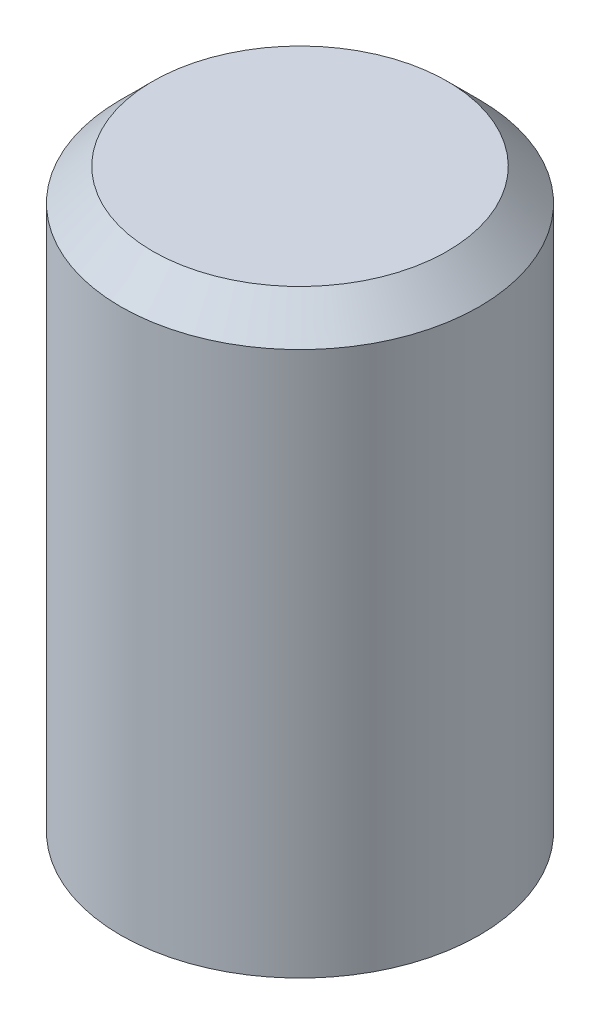
ISO-10303-21;
HEADER;
FILE_DESCRIPTION(('STEP AP214'),'2;1');
FILE_NAME('part.step','',(''),(''),'','','');
FILE_SCHEMA(('AUTOMOTIVE_DESIGN { 1 0 10303 214 1 1 1 1 }'));
ENDSEC;
DATA;
#1=APPLICATION_CONTEXT('core data for automotive mechanical design processes');
#2=APPLICATION_PROTOCOL_DEFINITION('international standard','automotive_design',2000,#1);
#3=PRODUCT_CONTEXT('',#1,'mechanical');
#4=PRODUCT('Part','Part','',(#3));
#5=PRODUCT_RELATED_PRODUCT_CATEGORY('part','',(#4));
#6=PRODUCT_DEFINITION_FORMATION('','',#4);
#7=PRODUCT_DEFINITION_CONTEXT('part definition',#1,'design');
#8=PRODUCT_DEFINITION('design','',#6,#7);
#9=PRODUCT_DEFINITION_SHAPE('','',#8);
#10=(LENGTH_UNIT() NAMED_UNIT(*) SI_UNIT(.MILLI.,.METRE.));
#11=(NAMED_UNIT(*) PLANE_ANGLE_UNIT() SI_UNIT($,.RADIAN.));
#12=(NAMED_UNIT(*) SI_UNIT($,.STERADIAN.) SOLID_ANGLE_UNIT());
#13=UNCERTAINTY_MEASURE_WITH_UNIT(LENGTH_MEASURE(1.E-05),#10,'distance_accuracy_value','');
#14=(GEOMETRIC_REPRESENTATION_CONTEXT(3) GLOBAL_UNCERTAINTY_ASSIGNED_CONTEXT((#13)) GLOBAL_UNIT_ASSIGNED_CONTEXT((#10,
#11,#12)) REPRESENTATION_CONTEXT('',''));
#15=CARTESIAN_POINT('',(0.,0.,0.));
#16=DIRECTION('',(0.,0.,1.));
#17=DIRECTION('',(1.,0.,0.));
#18=AXIS2_PLACEMENT_3D('',#15,#16,#17);
#19=CARTESIAN_POINT('',(0.,4.5,0.));
#20=DIRECTION('',(0.,-1.,0.));
#21=DIRECTION('',(0.,0.,-1.));
#22=AXIS2_PLACEMENT_3D('',#19,#20,#21);
#23=CYLINDRICAL_SURFACE('',#22,1.4);
#24=CARTESIAN_POINT('',(0.,4.25,0.));
#25=DIRECTION('',(0.,1.,0.));
#26=DIRECTION('',(0.,0.,1.));
#27=AXIS2_PLACEMENT_3D('',#24,#25,#26);
#28=CIRCLE('',#27,1.4);
#29=CARTESIAN_POINT('',(0.,4.25,1.4));
#30=VERTEX_POINT('',#29);
#31=EDGE_CURVE('E10',#30,#30,#28,.F.);
#32=ORIENTED_EDGE('',*,*,#31,.T.);
#33=EDGE_LOOP('',(#32));
#34=FACE_BOUND('',#33,.T.);
#35=CARTESIAN_POINT('',(0.,0.,0.));
#36=DIRECTION('',(0.,1.,0.));
#37=DIRECTION('',(0.,0.,1.));
#38=AXIS2_PLACEMENT_3D('',#35,#36,#37);
#39=CIRCLE('',#38,1.4);
#40=CARTESIAN_POINT('',(0.,0.,1.4));
#41=VERTEX_POINT('',#40);
#42=EDGE_CURVE('E55',#41,#41,#39,.T.);
#43=ORIENTED_EDGE('',*,*,#42,.T.);
#44=EDGE_LOOP('',(#43));
#45=FACE_BOUND('',#44,.T.);
#46=ADVANCED_FACE('F41',(#34,#45),#23,.T.);
#47=CARTESIAN_POINT('',(0.,4.5,0.));
#48=DIRECTION('',(0.,1.,0.));
#49=DIRECTION('',(0.,0.,1.));
#50=AXIS2_PLACEMENT_3D('',#47,#48,#49);
#51=PLANE('',#50);
#52=CARTESIAN_POINT('',(0.,4.5,0.));
#53=DIRECTION('',(0.,1.,0.));
#54=DIRECTION('',(0.,0.,1.));
#55=AXIS2_PLACEMENT_3D('',#52,#53,#54);
#56=CIRCLE('',#55,1.15);
#57=CARTESIAN_POINT('',(0.,4.5,1.15));
#58=VERTEX_POINT('',#57);
#59=EDGE_CURVE('E50',#58,#58,#56,.T.);
#60=ORIENTED_EDGE('',*,*,#59,.T.);
#61=EDGE_LOOP('',(#60));
#62=FACE_BOUND('',#61,.T.);
#63=ADVANCED_FACE('F66',(#62),#51,.T.);
#64=CARTESIAN_POINT('',(0.,0.,0.));
#65=DIRECTION('',(0.,1.,0.));
#66=DIRECTION('',(0.,0.,1.));
#67=AXIS2_PLACEMENT_3D('',#64,#65,#66);
#68=PLANE('',#67);
#69=ORIENTED_EDGE('',*,*,#42,.F.);
#70=EDGE_LOOP('',(#69));
#71=FACE_BOUND('',#70,.T.);
#72=ADVANCED_FACE('F64',(#71),#68,.F.);
#73=CARTESIAN_POINT('',(0.,4.5,0.));
#74=DIRECTION('',(0.,-1.,0.));
#75=DIRECTION('',(0.,0.,-1.));
#76=AXIS2_PLACEMENT_3D('',#73,#74,#75);
#77=CONICAL_SURFACE('',#76,1.15,0.785398163397448);
#78=ORIENTED_EDGE('',*,*,#31,.F.);
#79=EDGE_LOOP('',(#78));
#80=FACE_BOUND('',#79,.T.);
#81=ORIENTED_EDGE('',*,*,#59,.F.);
#82=EDGE_LOOP('',(#81));
#83=FACE_BOUND('',#82,.T.);
#84=ADVANCED_FACE('F44',(#80,#83),#77,.T.);
#85=CLOSED_SHELL('',(#46,#63,#72,#84));
#86=MANIFOLD_SOLID_BREP('B2',#85);
#87=ADVANCED_BREP_SHAPE_REPRESENTATION('',(#18,#86),#14);
#88=SHAPE_DEFINITION_REPRESENTATION(#9,#87);
ENDSEC;
END-ISO-10303-21;
